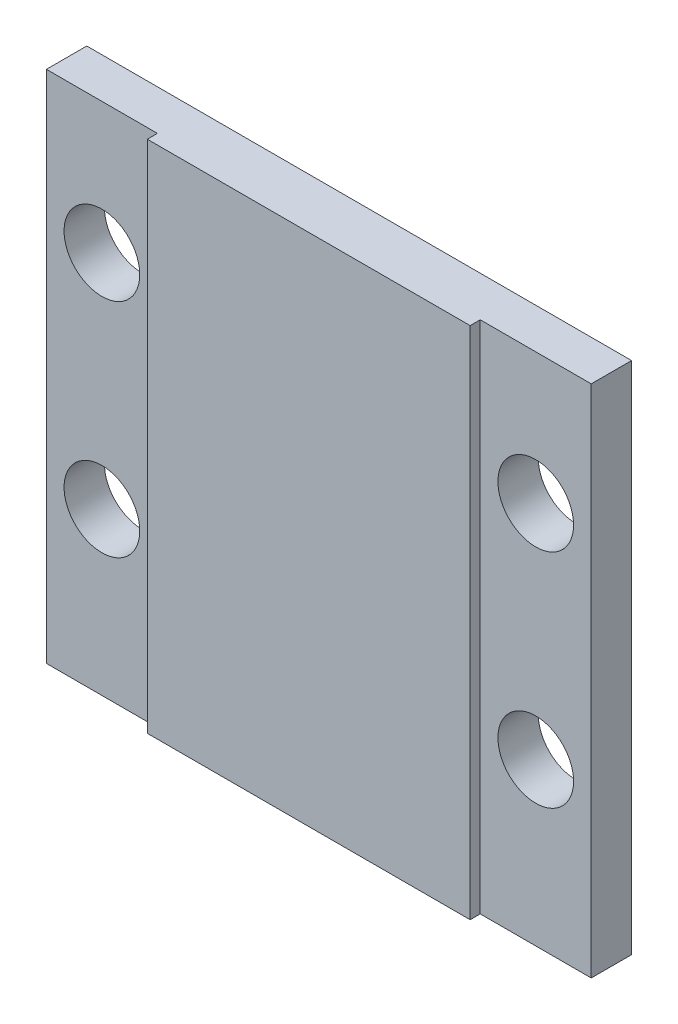
ISO-10303-21;
HEADER;
FILE_DESCRIPTION(('STEP AP214'),'2;1');
FILE_NAME('part.step','',(''),(''),'','','');
FILE_SCHEMA(('AUTOMOTIVE_DESIGN { 1 0 10303 214 1 1 1 1 }'));
ENDSEC;
DATA;
#1=APPLICATION_CONTEXT('core data for automotive mechanical design processes');
#2=APPLICATION_PROTOCOL_DEFINITION('international standard','automotive_design',2000,#1);
#3=PRODUCT_CONTEXT('',#1,'mechanical');
#4=PRODUCT('Part','Part','',(#3));
#5=PRODUCT_RELATED_PRODUCT_CATEGORY('part','',(#4));
#6=PRODUCT_DEFINITION_FORMATION('','',#4);
#7=PRODUCT_DEFINITION_CONTEXT('part definition',#1,'design');
#8=PRODUCT_DEFINITION('design','',#6,#7);
#9=PRODUCT_DEFINITION_SHAPE('','',#8);
#10=(LENGTH_UNIT() NAMED_UNIT(*) SI_UNIT(.MILLI.,.METRE.));
#11=(NAMED_UNIT(*) PLANE_ANGLE_UNIT() SI_UNIT($,.RADIAN.));
#12=(NAMED_UNIT(*) SI_UNIT($,.STERADIAN.) SOLID_ANGLE_UNIT());
#13=UNCERTAINTY_MEASURE_WITH_UNIT(LENGTH_MEASURE(1.E-05),#10,'distance_accuracy_value','');
#14=(GEOMETRIC_REPRESENTATION_CONTEXT(3) GLOBAL_UNCERTAINTY_ASSIGNED_CONTEXT((#13)) GLOBAL_UNIT_ASSIGNED_CONTEXT((#10,
#11,#12)) REPRESENTATION_CONTEXT('',''));
#15=CARTESIAN_POINT('',(0.,0.,0.));
#16=DIRECTION('',(0.,0.,1.));
#17=DIRECTION('',(1.,0.,0.));
#18=AXIS2_PLACEMENT_3D('',#15,#16,#17);
#19=CARTESIAN_POINT('',(0.,0.,0.));
#20=DIRECTION('',(0.,0.,1.));
#21=DIRECTION('',(1.,0.,0.));
#22=AXIS2_PLACEMENT_3D('',#19,#20,#21);
#23=PLANE('',#22);
#24=DIRECTION('',(0.,1.,0.));
#25=VECTOR('',#24,1.);
#26=CARTESIAN_POINT('',(16.,25.5,0.));
#27=LINE('',#26,#25);
#28=CARTESIAN_POINT('',(16.,-25.5,0.));
#29=VERTEX_POINT('',#28);
#30=CARTESIAN_POINT('',(16.,25.5,0.));
#31=VERTEX_POINT('',#30);
#32=EDGE_CURVE('E49',#29,#31,#27,.T.);
#33=ORIENTED_EDGE('',*,*,#32,.F.);
#34=DIRECTION('',(1.,0.,0.));
#35=VECTOR('',#34,1.);
#36=CARTESIAN_POINT('',(-27.,-25.5,0.));
#37=LINE('',#36,#35);
#38=CARTESIAN_POINT('',(27.,-25.5,0.));
#39=VERTEX_POINT('',#38);
#40=EDGE_CURVE('E144',#29,#39,#37,.T.);
#41=ORIENTED_EDGE('',*,*,#40,.T.);
#42=DIRECTION('',(0.,1.,0.));
#43=VECTOR('',#42,1.);
#44=CARTESIAN_POINT('',(27.,25.5,0.));
#45=LINE('',#44,#43);
#46=CARTESIAN_POINT('',(27.,25.5,0.));
#47=VERTEX_POINT('',#46);
#48=EDGE_CURVE('E175',#39,#47,#45,.T.);
#49=ORIENTED_EDGE('',*,*,#48,.T.);
#50=DIRECTION('',(-1.,0.,0.));
#51=VECTOR('',#50,1.);
#52=CARTESIAN_POINT('',(-27.,25.5,0.));
#53=LINE('',#52,#51);
#54=EDGE_CURVE('E163',#47,#31,#53,.T.);
#55=ORIENTED_EDGE('',*,*,#54,.T.);
#56=EDGE_LOOP('',(#33,#41,#49,#55));
#57=FACE_BOUND('',#56,.T.);
#58=CARTESIAN_POINT('',(21.5,12.5,0.));
#59=DIRECTION('',(0.,0.,1.));
#60=DIRECTION('',(1.,0.,0.));
#61=AXIS2_PLACEMENT_3D('',#58,#59,#60);
#62=CIRCLE('',#61,3.75);
#63=CARTESIAN_POINT('',(25.25,12.5,0.));
#64=VERTEX_POINT('',#63);
#65=EDGE_CURVE('E206',#64,#64,#62,.T.);
#66=ORIENTED_EDGE('',*,*,#65,.F.);
#67=EDGE_LOOP('',(#66));
#68=FACE_BOUND('',#67,.T.);
#69=CARTESIAN_POINT('',(21.5,-9.5,0.));
#70=DIRECTION('',(0.,0.,1.));
#71=DIRECTION('',(1.,0.,0.));
#72=AXIS2_PLACEMENT_3D('',#69,#70,#71);
#73=CIRCLE('',#72,3.75);
#74=CARTESIAN_POINT('',(25.25,-9.5,0.));
#75=VERTEX_POINT('',#74);
#76=EDGE_CURVE('E352',#75,#75,#73,.T.);
#77=ORIENTED_EDGE('',*,*,#76,.F.);
#78=EDGE_LOOP('',(#77));
#79=FACE_BOUND('',#78,.T.);
#80=ADVANCED_FACE('F32',(#57,#68,#79),#23,.T.);
#81=CARTESIAN_POINT('',(27.,25.5,-4.));
#82=DIRECTION('',(1.,0.,0.));
#83=DIRECTION('',(0.,1.,0.));
#84=AXIS2_PLACEMENT_3D('',#81,#82,#83);
#85=PLANE('',#84);
#86=ORIENTED_EDGE('',*,*,#48,.F.);
#87=DIRECTION('',(0.,0.,1.));
#88=VECTOR('',#87,1.);
#89=CARTESIAN_POINT('',(27.,-25.5,-4.));
#90=LINE('',#89,#88);
#91=CARTESIAN_POINT('',(27.,-25.5,-4.));
#92=VERTEX_POINT('',#91);
#93=EDGE_CURVE('E11',#92,#39,#90,.T.);
#94=ORIENTED_EDGE('',*,*,#93,.F.);
#95=DIRECTION('',(0.,1.,0.));
#96=VECTOR('',#95,1.);
#97=CARTESIAN_POINT('',(27.,25.5,-4.));
#98=LINE('',#97,#96);
#99=CARTESIAN_POINT('',(27.,25.5,-4.));
#100=VERTEX_POINT('',#99);
#101=EDGE_CURVE('E161',#92,#100,#98,.T.);
#102=ORIENTED_EDGE('',*,*,#101,.T.);
#103=DIRECTION('',(0.,0.,1.));
#104=VECTOR('',#103,1.);
#105=CARTESIAN_POINT('',(27.,25.5,-4.));
#106=LINE('',#105,#104);
#107=EDGE_CURVE('E177',#100,#47,#106,.T.);
#108=ORIENTED_EDGE('',*,*,#107,.T.);
#109=EDGE_LOOP('',(#86,#94,#102,#108));
#110=FACE_BOUND('',#109,.T.);
#111=ADVANCED_FACE('F34',(#110),#85,.T.);
#112=CARTESIAN_POINT('',(-27.,-25.5,-4.));
#113=DIRECTION('',(0.,-1.,0.));
#114=DIRECTION('',(0.,0.,-1.));
#115=AXIS2_PLACEMENT_3D('',#112,#113,#114);
#116=PLANE('',#115);
#117=CARTESIAN_POINT('',(-27.,-25.5,0.));
#118=VERTEX_POINT('',#117);
#119=CARTESIAN_POINT('',(-16.,-25.5,0.));
#120=VERTEX_POINT('',#119);
#121=EDGE_CURVE('E159',#118,#120,#37,.T.);
#122=ORIENTED_EDGE('',*,*,#121,.F.);
#123=DIRECTION('',(0.,0.,1.));
#124=VECTOR('',#123,1.);
#125=CARTESIAN_POINT('',(-27.,-25.5,-4.));
#126=LINE('',#125,#124);
#127=CARTESIAN_POINT('',(-27.,-25.5,-4.));
#128=VERTEX_POINT('',#127);
#129=EDGE_CURVE('E41',#128,#118,#126,.T.);
#130=ORIENTED_EDGE('',*,*,#129,.F.);
#131=DIRECTION('',(1.,0.,0.));
#132=VECTOR('',#131,1.);
#133=CARTESIAN_POINT('',(-27.,-25.5,-4.));
#134=LINE('',#133,#132);
#135=EDGE_CURVE('E180',#128,#92,#134,.T.);
#136=ORIENTED_EDGE('',*,*,#135,.T.);
#137=ORIENTED_EDGE('',*,*,#93,.T.);
#138=ORIENTED_EDGE('',*,*,#40,.F.);
#139=DIRECTION('',(0.,0.,-1.));
#140=VECTOR('',#139,1.);
#141=CARTESIAN_POINT('',(16.,-25.5,1.));
#142=LINE('',#141,#140);
#143=CARTESIAN_POINT('',(16.,-25.5,1.));
#144=VERTEX_POINT('',#143);
#145=EDGE_CURVE('E134',#144,#29,#142,.T.);
#146=ORIENTED_EDGE('',*,*,#145,.F.);
#147=DIRECTION('',(1.,0.,0.));
#148=VECTOR('',#147,1.);
#149=CARTESIAN_POINT('',(-16.,-25.5,1.));
#150=LINE('',#149,#148);
#151=CARTESIAN_POINT('',(-16.,-25.5,1.));
#152=VERTEX_POINT('',#151);
#153=EDGE_CURVE('E115',#152,#144,#150,.T.);
#154=ORIENTED_EDGE('',*,*,#153,.F.);
#155=DIRECTION('',(0.,0.,-1.));
#156=VECTOR('',#155,1.);
#157=CARTESIAN_POINT('',(-16.,-25.5,1.));
#158=LINE('',#157,#156);
#159=EDGE_CURVE('E126',#152,#120,#158,.T.);
#160=ORIENTED_EDGE('',*,*,#159,.T.);
#161=EDGE_LOOP('',(#122,#130,#136,#137,#138,#146,#154,#160));
#162=FACE_BOUND('',#161,.T.);
#163=ADVANCED_FACE('F155',(#162),#116,.T.);
#164=CARTESIAN_POINT('',(-27.,25.5,-4.));
#165=DIRECTION('',(-1.,0.,0.));
#166=DIRECTION('',(0.,-1.,0.));
#167=AXIS2_PLACEMENT_3D('',#164,#165,#166);
#168=PLANE('',#167);
#169=DIRECTION('',(0.,-1.,0.));
#170=VECTOR('',#169,1.);
#171=CARTESIAN_POINT('',(-27.,25.5,0.));
#172=LINE('',#171,#170);
#173=CARTESIAN_POINT('',(-27.,25.5,0.));
#174=VERTEX_POINT('',#173);
#175=EDGE_CURVE('E160',#174,#118,#172,.T.);
#176=ORIENTED_EDGE('',*,*,#175,.F.);
#177=DIRECTION('',(0.,0.,1.));
#178=VECTOR('',#177,1.);
#179=CARTESIAN_POINT('',(-27.,25.5,-4.));
#180=LINE('',#179,#178);
#181=CARTESIAN_POINT('',(-27.,25.5,-4.));
#182=VERTEX_POINT('',#181);
#183=EDGE_CURVE('E179',#182,#174,#180,.T.);
#184=ORIENTED_EDGE('',*,*,#183,.F.);
#185=DIRECTION('',(0.,-1.,0.));
#186=VECTOR('',#185,1.);
#187=CARTESIAN_POINT('',(-27.,25.5,-4.));
#188=LINE('',#187,#186);
#189=EDGE_CURVE('E186',#182,#128,#188,.T.);
#190=ORIENTED_EDGE('',*,*,#189,.T.);
#191=ORIENTED_EDGE('',*,*,#129,.T.);
#192=EDGE_LOOP('',(#176,#184,#190,#191));
#193=FACE_BOUND('',#192,.T.);
#194=ADVANCED_FACE('F184',(#193),#168,.T.);
#195=CARTESIAN_POINT('',(-27.,25.5,-4.));
#196=DIRECTION('',(0.,1.,0.));
#197=DIRECTION('',(0.,0.,1.));
#198=AXIS2_PLACEMENT_3D('',#195,#196,#197);
#199=PLANE('',#198);
#200=ORIENTED_EDGE('',*,*,#54,.F.);
#201=ORIENTED_EDGE('',*,*,#107,.F.);
#202=DIRECTION('',(-1.,0.,0.));
#203=VECTOR('',#202,1.);
#204=CARTESIAN_POINT('',(-27.,25.5,-4.));
#205=LINE('',#204,#203);
#206=EDGE_CURVE('E212',#100,#182,#205,.T.);
#207=ORIENTED_EDGE('',*,*,#206,.T.);
#208=ORIENTED_EDGE('',*,*,#183,.T.);
#209=CARTESIAN_POINT('',(-16.,25.5,0.));
#210=VERTEX_POINT('',#209);
#211=EDGE_CURVE('E166',#210,#174,#53,.T.);
#212=ORIENTED_EDGE('',*,*,#211,.F.);
#213=DIRECTION('',(0.,0.,-1.));
#214=VECTOR('',#213,1.);
#215=CARTESIAN_POINT('',(-16.,25.5,1.));
#216=LINE('',#215,#214);
#217=CARTESIAN_POINT('',(-16.,25.5,1.));
#218=VERTEX_POINT('',#217);
#219=EDGE_CURVE('E106',#218,#210,#216,.T.);
#220=ORIENTED_EDGE('',*,*,#219,.F.);
#221=DIRECTION('',(-1.,0.,0.));
#222=VECTOR('',#221,1.);
#223=CARTESIAN_POINT('',(-16.,25.5,1.));
#224=LINE('',#223,#222);
#225=CARTESIAN_POINT('',(16.,25.5,1.));
#226=VERTEX_POINT('',#225);
#227=EDGE_CURVE('E99',#226,#218,#224,.T.);
#228=ORIENTED_EDGE('',*,*,#227,.F.);
#229=DIRECTION('',(0.,0.,-1.));
#230=VECTOR('',#229,1.);
#231=CARTESIAN_POINT('',(16.,25.5,1.));
#232=LINE('',#231,#230);
#233=EDGE_CURVE('E104',#226,#31,#232,.T.);
#234=ORIENTED_EDGE('',*,*,#233,.T.);
#235=EDGE_LOOP('',(#200,#201,#207,#208,#212,#220,#228,#234));
#236=FACE_BOUND('',#235,.T.);
#237=ADVANCED_FACE('F102',(#236),#199,.T.);
#238=CARTESIAN_POINT('',(0.,0.,-4.));
#239=DIRECTION('',(0.,0.,1.));
#240=DIRECTION('',(1.,0.,0.));
#241=AXIS2_PLACEMENT_3D('',#238,#239,#240);
#242=PLANE('',#241);
#243=CARTESIAN_POINT('',(-21.5,-9.5,-4.));
#244=DIRECTION('',(0.,0.,1.));
#245=DIRECTION('',(1.,0.,0.));
#246=AXIS2_PLACEMENT_3D('',#243,#244,#245);
#247=CIRCLE('',#246,3.75);
#248=CARTESIAN_POINT('',(-17.75,-9.5,-4.));
#249=VERTEX_POINT('',#248);
#250=EDGE_CURVE('E124',#249,#249,#247,.T.);
#251=ORIENTED_EDGE('',*,*,#250,.T.);
#252=EDGE_LOOP('',(#251));
#253=FACE_BOUND('',#252,.T.);
#254=CARTESIAN_POINT('',(21.5,-9.5,-4.));
#255=DIRECTION('',(0.,0.,1.));
#256=DIRECTION('',(1.,0.,0.));
#257=AXIS2_PLACEMENT_3D('',#254,#255,#256);
#258=CIRCLE('',#257,3.75);
#259=CARTESIAN_POINT('',(25.25,-9.5,-4.));
#260=VERTEX_POINT('',#259);
#261=EDGE_CURVE('E350',#260,#260,#258,.T.);
#262=ORIENTED_EDGE('',*,*,#261,.T.);
#263=EDGE_LOOP('',(#262));
#264=FACE_BOUND('',#263,.T.);
#265=CARTESIAN_POINT('',(21.5,12.5,-4.));
#266=DIRECTION('',(0.,0.,1.));
#267=DIRECTION('',(1.,0.,0.));
#268=AXIS2_PLACEMENT_3D('',#265,#266,#267);
#269=CIRCLE('',#268,3.75);
#270=CARTESIAN_POINT('',(25.25,12.5,-4.));
#271=VERTEX_POINT('',#270);
#272=EDGE_CURVE('E201',#271,#271,#269,.T.);
#273=ORIENTED_EDGE('',*,*,#272,.T.);
#274=EDGE_LOOP('',(#273));
#275=FACE_BOUND('',#274,.T.);
#276=CARTESIAN_POINT('',(-21.5,12.5,-4.));
#277=DIRECTION('',(0.,0.,1.));
#278=DIRECTION('',(1.,0.,0.));
#279=AXIS2_PLACEMENT_3D('',#276,#277,#278);
#280=CIRCLE('',#279,3.75);
#281=CARTESIAN_POINT('',(-17.75,12.5,-4.));
#282=VERTEX_POINT('',#281);
#283=EDGE_CURVE('E200',#282,#282,#280,.T.);
#284=ORIENTED_EDGE('',*,*,#283,.T.);
#285=EDGE_LOOP('',(#284));
#286=FACE_BOUND('',#285,.T.);
#287=ORIENTED_EDGE('',*,*,#101,.F.);
#288=ORIENTED_EDGE('',*,*,#135,.F.);
#289=ORIENTED_EDGE('',*,*,#189,.F.);
#290=ORIENTED_EDGE('',*,*,#206,.F.);
#291=EDGE_LOOP('',(#287,#288,#289,#290));
#292=FACE_BOUND('',#291,.T.);
#293=ADVANCED_FACE('F192',(#253,#264,#275,#286,#292),#242,.F.);
#294=DIRECTION('',(0.,-1.,0.));
#295=VECTOR('',#294,1.);
#296=CARTESIAN_POINT('',(-16.,25.5,0.));
#297=LINE('',#296,#295);
#298=EDGE_CURVE('E57',#210,#120,#297,.T.);
#299=ORIENTED_EDGE('',*,*,#298,.F.);
#300=ORIENTED_EDGE('',*,*,#211,.T.);
#301=ORIENTED_EDGE('',*,*,#175,.T.);
#302=ORIENTED_EDGE('',*,*,#121,.T.);
#303=EDGE_LOOP('',(#299,#300,#301,#302));
#304=FACE_BOUND('',#303,.T.);
#305=CARTESIAN_POINT('',(-21.5,-9.5,0.));
#306=DIRECTION('',(0.,0.,1.));
#307=DIRECTION('',(1.,0.,0.));
#308=AXIS2_PLACEMENT_3D('',#305,#306,#307);
#309=CIRCLE('',#308,3.75);
#310=CARTESIAN_POINT('',(-17.75,-9.5,0.));
#311=VERTEX_POINT('',#310);
#312=EDGE_CURVE('E121',#311,#311,#309,.T.);
#313=ORIENTED_EDGE('',*,*,#312,.F.);
#314=EDGE_LOOP('',(#313));
#315=FACE_BOUND('',#314,.T.);
#316=CARTESIAN_POINT('',(-21.5,12.5,0.));
#317=DIRECTION('',(0.,0.,1.));
#318=DIRECTION('',(1.,0.,0.));
#319=AXIS2_PLACEMENT_3D('',#316,#317,#318);
#320=CIRCLE('',#319,3.75);
#321=CARTESIAN_POINT('',(-17.75,12.5,0.));
#322=VERTEX_POINT('',#321);
#323=EDGE_CURVE('E198',#322,#322,#320,.T.);
#324=ORIENTED_EDGE('',*,*,#323,.F.);
#325=EDGE_LOOP('',(#324));
#326=FACE_BOUND('',#325,.T.);
#327=ADVANCED_FACE('F188',(#304,#315,#326),#23,.T.);
#328=CARTESIAN_POINT('',(-21.5,12.5,-4.));
#329=DIRECTION('',(0.,0.,1.));
#330=DIRECTION('',(1.,0.,0.));
#331=AXIS2_PLACEMENT_3D('',#328,#329,#330);
#332=CYLINDRICAL_SURFACE('',#331,3.75);
#333=ORIENTED_EDGE('',*,*,#283,.F.);
#334=EDGE_LOOP('',(#333));
#335=FACE_BOUND('',#334,.T.);
#336=ORIENTED_EDGE('',*,*,#323,.T.);
#337=EDGE_LOOP('',(#336));
#338=FACE_BOUND('',#337,.T.);
#339=ADVANCED_FACE('F191',(#335,#338),#332,.F.);
#340=CARTESIAN_POINT('',(21.5,12.5,-4.));
#341=DIRECTION('',(0.,0.,1.));
#342=DIRECTION('',(1.,0.,0.));
#343=AXIS2_PLACEMENT_3D('',#340,#341,#342);
#344=CYLINDRICAL_SURFACE('',#343,3.75);
#345=ORIENTED_EDGE('',*,*,#272,.F.);
#346=EDGE_LOOP('',(#345));
#347=FACE_BOUND('',#346,.T.);
#348=ORIENTED_EDGE('',*,*,#65,.T.);
#349=EDGE_LOOP('',(#348));
#350=FACE_BOUND('',#349,.T.);
#351=ADVANCED_FACE('F295',(#347,#350),#344,.F.);
#352=CARTESIAN_POINT('',(21.5,-9.5,-4.));
#353=DIRECTION('',(0.,0.,1.));
#354=DIRECTION('',(1.,0.,0.));
#355=AXIS2_PLACEMENT_3D('',#352,#353,#354);
#356=CYLINDRICAL_SURFACE('',#355,3.75);
#357=ORIENTED_EDGE('',*,*,#261,.F.);
#358=EDGE_LOOP('',(#357));
#359=FACE_BOUND('',#358,.T.);
#360=ORIENTED_EDGE('',*,*,#76,.T.);
#361=EDGE_LOOP('',(#360));
#362=FACE_BOUND('',#361,.T.);
#363=ADVANCED_FACE('F291',(#359,#362),#356,.F.);
#364=CARTESIAN_POINT('',(-21.5,-9.5,-4.));
#365=DIRECTION('',(0.,0.,1.));
#366=DIRECTION('',(1.,0.,0.));
#367=AXIS2_PLACEMENT_3D('',#364,#365,#366);
#368=CYLINDRICAL_SURFACE('',#367,3.75);
#369=ORIENTED_EDGE('',*,*,#250,.F.);
#370=EDGE_LOOP('',(#369));
#371=FACE_BOUND('',#370,.T.);
#372=ORIENTED_EDGE('',*,*,#312,.T.);
#373=EDGE_LOOP('',(#372));
#374=FACE_BOUND('',#373,.T.);
#375=ADVANCED_FACE('F268',(#371,#374),#368,.F.);
#376=CARTESIAN_POINT('',(16.,25.5,1.));
#377=DIRECTION('',(-1.,0.,0.));
#378=DIRECTION('',(0.,0.,1.));
#379=AXIS2_PLACEMENT_3D('',#376,#377,#378);
#380=PLANE('',#379);
#381=ORIENTED_EDGE('',*,*,#32,.T.);
#382=ORIENTED_EDGE('',*,*,#233,.F.);
#383=DIRECTION('',(0.,1.,0.));
#384=VECTOR('',#383,1.);
#385=CARTESIAN_POINT('',(16.,25.5,1.));
#386=LINE('',#385,#384);
#387=EDGE_CURVE('E110',#144,#226,#386,.T.);
#388=ORIENTED_EDGE('',*,*,#387,.F.);
#389=ORIENTED_EDGE('',*,*,#145,.T.);
#390=EDGE_LOOP('',(#381,#382,#388,#389));
#391=FACE_BOUND('',#390,.T.);
#392=ADVANCED_FACE('F120',(#391),#380,.F.);
#393=CARTESIAN_POINT('',(-16.,25.5,1.));
#394=DIRECTION('',(1.,0.,0.));
#395=DIRECTION('',(0.,0.,-1.));
#396=AXIS2_PLACEMENT_3D('',#393,#394,#395);
#397=PLANE('',#396);
#398=ORIENTED_EDGE('',*,*,#298,.T.);
#399=ORIENTED_EDGE('',*,*,#159,.F.);
#400=DIRECTION('',(0.,-1.,0.));
#401=VECTOR('',#400,1.);
#402=CARTESIAN_POINT('',(-16.,25.5,1.));
#403=LINE('',#402,#401);
#404=EDGE_CURVE('E109',#218,#152,#403,.T.);
#405=ORIENTED_EDGE('',*,*,#404,.F.);
#406=ORIENTED_EDGE('',*,*,#219,.T.);
#407=EDGE_LOOP('',(#398,#399,#405,#406));
#408=FACE_BOUND('',#407,.T.);
#409=ADVANCED_FACE('F154',(#408),#397,.F.);
#410=CARTESIAN_POINT('',(0.,0.,1.));
#411=DIRECTION('',(0.,0.,1.));
#412=DIRECTION('',(1.,0.,0.));
#413=AXIS2_PLACEMENT_3D('',#410,#411,#412);
#414=PLANE('',#413);
#415=ORIENTED_EDGE('',*,*,#387,.T.);
#416=ORIENTED_EDGE('',*,*,#227,.T.);
#417=ORIENTED_EDGE('',*,*,#404,.T.);
#418=ORIENTED_EDGE('',*,*,#153,.T.);
#419=EDGE_LOOP('',(#415,#416,#417,#418));
#420=FACE_BOUND('',#419,.T.);
#421=ADVANCED_FACE('F113',(#420),#414,.T.);
#422=CLOSED_SHELL('',(#80,#111,#163,#194,#237,#293,#327,#339,#351,#363,#375,#392,#409,#421));
#423=MANIFOLD_SOLID_BREP('B2',#422);
#424=ADVANCED_BREP_SHAPE_REPRESENTATION('',(#18,#423),#14);
#425=SHAPE_DEFINITION_REPRESENTATION(#9,#424);
ENDSEC;
END-ISO-10303-21;
